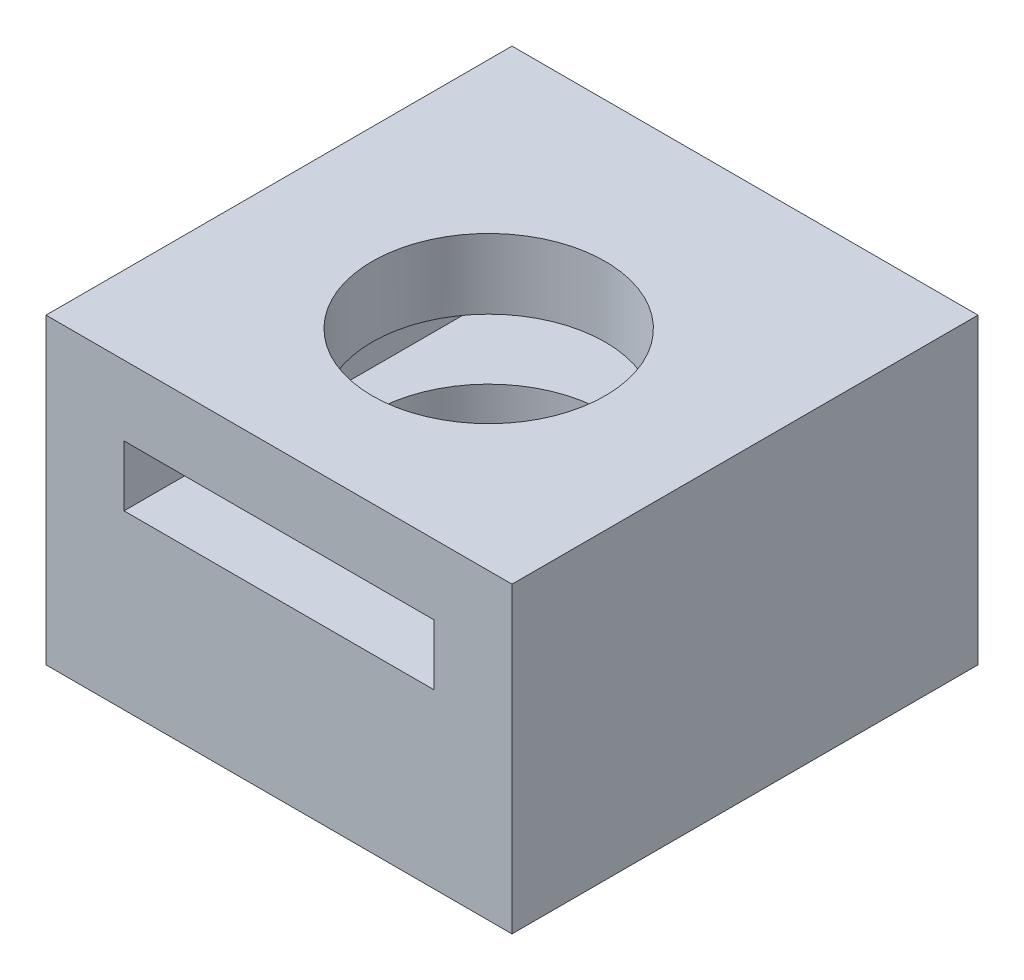
ISO-10303-21;
HEADER;
FILE_DESCRIPTION(('STEP AP214'),'2;1');
FILE_NAME('part.step','',(''),(''),'','','');
FILE_SCHEMA(('AUTOMOTIVE_DESIGN { 1 0 10303 214 1 1 1 1 }'));
ENDSEC;
DATA;
#1=APPLICATION_CONTEXT('core data for automotive mechanical design processes');
#2=APPLICATION_PROTOCOL_DEFINITION('international standard','automotive_design',2000,#1);
#3=PRODUCT_CONTEXT('',#1,'mechanical');
#4=PRODUCT('Part','Part','',(#3));
#5=PRODUCT_RELATED_PRODUCT_CATEGORY('part','',(#4));
#6=PRODUCT_DEFINITION_FORMATION('','',#4);
#7=PRODUCT_DEFINITION_CONTEXT('part definition',#1,'design');
#8=PRODUCT_DEFINITION('design','',#6,#7);
#9=PRODUCT_DEFINITION_SHAPE('','',#8);
#10=(LENGTH_UNIT() NAMED_UNIT(*) SI_UNIT(.MILLI.,.METRE.));
#11=(NAMED_UNIT(*) PLANE_ANGLE_UNIT() SI_UNIT($,.RADIAN.));
#12=(NAMED_UNIT(*) SI_UNIT($,.STERADIAN.) SOLID_ANGLE_UNIT());
#13=UNCERTAINTY_MEASURE_WITH_UNIT(LENGTH_MEASURE(1.E-05),#10,'distance_accuracy_value','');
#14=(GEOMETRIC_REPRESENTATION_CONTEXT(3) GLOBAL_UNCERTAINTY_ASSIGNED_CONTEXT((#13)) GLOBAL_UNIT_ASSIGNED_CONTEXT((#10,
#11,#12)) REPRESENTATION_CONTEXT('',''));
#15=CARTESIAN_POINT('',(0.,0.,0.));
#16=DIRECTION('',(0.,0.,1.));
#17=DIRECTION('',(1.,0.,0.));
#18=AXIS2_PLACEMENT_3D('',#15,#16,#17);
#19=CARTESIAN_POINT('',(0.,13.,0.));
#20=DIRECTION('',(-1.,0.,0.));
#21=DIRECTION('',(0.,0.,1.));
#22=AXIS2_PLACEMENT_3D('',#19,#20,#21);
#23=PLANE('',#22);
#24=DIRECTION('',(0.,0.,-1.));
#25=VECTOR('',#24,1.);
#26=CARTESIAN_POINT('',(0.,0.,0.));
#27=LINE('',#26,#25);
#28=CARTESIAN_POINT('',(0.,0.,20.));
#29=VERTEX_POINT('',#28);
#30=CARTESIAN_POINT('',(0.,0.,0.));
#31=VERTEX_POINT('',#30);
#32=EDGE_CURVE('E162',#29,#31,#27,.T.);
#33=ORIENTED_EDGE('',*,*,#32,.T.);
#34=DIRECTION('',(0.,-1.,0.));
#35=VECTOR('',#34,1.);
#36=CARTESIAN_POINT('',(0.,13.,0.));
#37=LINE('',#36,#35);
#38=CARTESIAN_POINT('',(0.,13.,0.));
#39=VERTEX_POINT('',#38);
#40=EDGE_CURVE('E11',#39,#31,#37,.T.);
#41=ORIENTED_EDGE('',*,*,#40,.F.);
#42=DIRECTION('',(0.,0.,-1.));
#43=VECTOR('',#42,1.);
#44=CARTESIAN_POINT('',(0.,13.,0.));
#45=LINE('',#44,#43);
#46=CARTESIAN_POINT('',(0.,13.,20.));
#47=VERTEX_POINT('',#46);
#48=EDGE_CURVE('E168',#47,#39,#45,.T.);
#49=ORIENTED_EDGE('',*,*,#48,.F.);
#50=DIRECTION('',(0.,-1.,0.));
#51=VECTOR('',#50,1.);
#52=CARTESIAN_POINT('',(0.,13.,20.));
#53=LINE('',#52,#51);
#54=EDGE_CURVE('E178',#47,#29,#53,.T.);
#55=ORIENTED_EDGE('',*,*,#54,.T.);
#56=EDGE_LOOP('',(#33,#41,#49,#55));
#57=FACE_BOUND('',#56,.T.);
#58=ADVANCED_FACE('F39',(#57),#23,.F.);
#59=CARTESIAN_POINT('',(0.,13.,0.));
#60=DIRECTION('',(0.,0.,1.));
#61=DIRECTION('',(1.,0.,0.));
#62=AXIS2_PLACEMENT_3D('',#59,#60,#61);
#63=PLANE('',#62);
#64=DIRECTION('',(-1.,0.,0.));
#65=VECTOR('',#64,1.);
#66=CARTESIAN_POINT('',(0.,0.,0.));
#67=LINE('',#66,#65);
#68=CARTESIAN_POINT('',(-20.,0.,0.));
#69=VERTEX_POINT('',#68);
#70=EDGE_CURVE('E182',#31,#69,#67,.T.);
#71=ORIENTED_EDGE('',*,*,#70,.T.);
#72=DIRECTION('',(0.,-1.,0.));
#73=VECTOR('',#72,1.);
#74=CARTESIAN_POINT('',(-20.,13.,0.));
#75=LINE('',#74,#73);
#76=CARTESIAN_POINT('',(-20.,13.,0.));
#77=VERTEX_POINT('',#76);
#78=EDGE_CURVE('E48',#77,#69,#75,.T.);
#79=ORIENTED_EDGE('',*,*,#78,.F.);
#80=DIRECTION('',(-1.,0.,0.));
#81=VECTOR('',#80,1.);
#82=CARTESIAN_POINT('',(0.,13.,0.));
#83=LINE('',#82,#81);
#84=EDGE_CURVE('E92',#39,#77,#83,.T.);
#85=ORIENTED_EDGE('',*,*,#84,.F.);
#86=ORIENTED_EDGE('',*,*,#40,.T.);
#87=EDGE_LOOP('',(#71,#79,#85,#86));
#88=FACE_BOUND('',#87,.T.);
#89=ADVANCED_FACE('F219',(#88),#63,.F.);
#90=CARTESIAN_POINT('',(-20.,13.,0.));
#91=DIRECTION('',(1.,0.,0.));
#92=DIRECTION('',(0.,0.,-1.));
#93=AXIS2_PLACEMENT_3D('',#90,#91,#92);
#94=PLANE('',#93);
#95=DIRECTION('',(0.,0.,1.));
#96=VECTOR('',#95,1.);
#97=CARTESIAN_POINT('',(-20.,0.,0.));
#98=LINE('',#97,#96);
#99=CARTESIAN_POINT('',(-20.,0.,20.));
#100=VERTEX_POINT('',#99);
#101=EDGE_CURVE('E185',#69,#100,#98,.T.);
#102=ORIENTED_EDGE('',*,*,#101,.T.);
#103=DIRECTION('',(0.,-1.,0.));
#104=VECTOR('',#103,1.);
#105=CARTESIAN_POINT('',(-20.,13.,20.));
#106=LINE('',#105,#104);
#107=CARTESIAN_POINT('',(-20.,13.,20.));
#108=VERTEX_POINT('',#107);
#109=EDGE_CURVE('E192',#108,#100,#106,.T.);
#110=ORIENTED_EDGE('',*,*,#109,.F.);
#111=DIRECTION('',(0.,0.,1.));
#112=VECTOR('',#111,1.);
#113=CARTESIAN_POINT('',(-20.,13.,0.));
#114=LINE('',#113,#112);
#115=EDGE_CURVE('E173',#77,#108,#114,.T.);
#116=ORIENTED_EDGE('',*,*,#115,.F.);
#117=ORIENTED_EDGE('',*,*,#78,.T.);
#118=EDGE_LOOP('',(#102,#110,#116,#117));
#119=FACE_BOUND('',#118,.T.);
#120=ADVANCED_FACE('F200',(#119),#94,.F.);
#121=CARTESIAN_POINT('',(0.,13.,20.));
#122=DIRECTION('',(0.,0.,-1.));
#123=DIRECTION('',(-1.,0.,0.));
#124=AXIS2_PLACEMENT_3D('',#121,#122,#123);
#125=PLANE('',#124);
#126=DIRECTION('',(1.,0.,0.));
#127=VECTOR('',#126,1.);
#128=CARTESIAN_POINT('',(-16.65,7.4,20.));
#129=LINE('',#128,#127);
#130=CARTESIAN_POINT('',(-16.65,7.4,20.));
#131=VERTEX_POINT('',#130);
#132=CARTESIAN_POINT('',(-3.34999999999999,7.4,20.));
#133=VERTEX_POINT('',#132);
#134=EDGE_CURVE('E153',#131,#133,#129,.T.);
#135=ORIENTED_EDGE('',*,*,#134,.F.);
#136=DIRECTION('',(0.,-1.,0.));
#137=VECTOR('',#136,1.);
#138=CARTESIAN_POINT('',(-16.65,10.,20.));
#139=LINE('',#138,#137);
#140=CARTESIAN_POINT('',(-16.65,10.,20.));
#141=VERTEX_POINT('',#140);
#142=EDGE_CURVE('E55',#141,#131,#139,.T.);
#143=ORIENTED_EDGE('',*,*,#142,.F.);
#144=DIRECTION('',(-1.,0.,0.));
#145=VECTOR('',#144,1.);
#146=CARTESIAN_POINT('',(-16.65,10.,20.));
#147=LINE('',#146,#145);
#148=CARTESIAN_POINT('',(-3.34999999999999,10.,20.));
#149=VERTEX_POINT('',#148);
#150=EDGE_CURVE('E137',#149,#141,#147,.T.);
#151=ORIENTED_EDGE('',*,*,#150,.F.);
#152=DIRECTION('',(0.,1.,0.));
#153=VECTOR('',#152,1.);
#154=CARTESIAN_POINT('',(-3.34999999999999,10.,20.));
#155=LINE('',#154,#153);
#156=EDGE_CURVE('E141',#133,#149,#155,.T.);
#157=ORIENTED_EDGE('',*,*,#156,.F.);
#158=EDGE_LOOP('',(#135,#143,#151,#157));
#159=FACE_BOUND('',#158,.T.);
#160=DIRECTION('',(1.,0.,0.));
#161=VECTOR('',#160,1.);
#162=CARTESIAN_POINT('',(0.,0.,20.));
#163=LINE('',#162,#161);
#164=EDGE_CURVE('E85',#100,#29,#163,.T.);
#165=ORIENTED_EDGE('',*,*,#164,.T.);
#166=ORIENTED_EDGE('',*,*,#54,.F.);
#167=DIRECTION('',(1.,0.,0.));
#168=VECTOR('',#167,1.);
#169=CARTESIAN_POINT('',(0.,13.,20.));
#170=LINE('',#169,#168);
#171=EDGE_CURVE('E64',#108,#47,#170,.T.);
#172=ORIENTED_EDGE('',*,*,#171,.F.);
#173=ORIENTED_EDGE('',*,*,#109,.T.);
#174=EDGE_LOOP('',(#165,#166,#172,#173));
#175=FACE_BOUND('',#174,.T.);
#176=ADVANCED_FACE('F208',(#159,#175),#125,.F.);
#177=CARTESIAN_POINT('',(0.,13.,0.));
#178=DIRECTION('',(0.,-1.,0.));
#179=DIRECTION('',(0.,0.,-1.));
#180=AXIS2_PLACEMENT_3D('',#177,#178,#179);
#181=PLANE('',#180);
#182=CARTESIAN_POINT('',(-10.,13.,11.));
#183=DIRECTION('',(0.,1.,0.));
#184=DIRECTION('',(0.,0.,1.));
#185=AXIS2_PLACEMENT_3D('',#182,#183,#184);
#186=CIRCLE('',#185,5.);
#187=CARTESIAN_POINT('',(-10.,13.,16.));
#188=VERTEX_POINT('',#187);
#189=EDGE_CURVE('E321',#188,#188,#186,.T.);
#190=ORIENTED_EDGE('',*,*,#189,.F.);
#191=EDGE_LOOP('',(#190));
#192=FACE_BOUND('',#191,.T.);
#193=ORIENTED_EDGE('',*,*,#48,.T.);
#194=ORIENTED_EDGE('',*,*,#84,.T.);
#195=ORIENTED_EDGE('',*,*,#115,.T.);
#196=ORIENTED_EDGE('',*,*,#171,.T.);
#197=EDGE_LOOP('',(#193,#194,#195,#196));
#198=FACE_BOUND('',#197,.T.);
#199=ADVANCED_FACE('F210',(#192,#198),#181,.F.);
#200=CARTESIAN_POINT('',(0.,0.,0.));
#201=DIRECTION('',(0.,-1.,0.));
#202=DIRECTION('',(0.,0.,-1.));
#203=AXIS2_PLACEMENT_3D('',#200,#201,#202);
#204=PLANE('',#203);
#205=CARTESIAN_POINT('',(-10.,0.,11.));
#206=DIRECTION('',(0.,-1.,0.));
#207=DIRECTION('',(0.,0.,-1.));
#208=AXIS2_PLACEMENT_3D('',#205,#206,#207);
#209=CIRCLE('',#208,5.);
#210=CARTESIAN_POINT('',(-10.,0.,6.));
#211=VERTEX_POINT('',#210);
#212=EDGE_CURVE('E327',#211,#211,#209,.F.);
#213=ORIENTED_EDGE('',*,*,#212,.T.);
#214=EDGE_LOOP('',(#213));
#215=FACE_BOUND('',#214,.T.);
#216=ORIENTED_EDGE('',*,*,#32,.F.);
#217=ORIENTED_EDGE('',*,*,#164,.F.);
#218=ORIENTED_EDGE('',*,*,#101,.F.);
#219=ORIENTED_EDGE('',*,*,#70,.F.);
#220=EDGE_LOOP('',(#216,#217,#218,#219));
#221=FACE_BOUND('',#220,.T.);
#222=ADVANCED_FACE('F204',(#215,#221),#204,.T.);
#223=CARTESIAN_POINT('',(-16.65,10.,2.));
#224=DIRECTION('',(-1.,0.,0.));
#225=DIRECTION('',(0.,0.,1.));
#226=AXIS2_PLACEMENT_3D('',#223,#224,#225);
#227=PLANE('',#226);
#228=ORIENTED_EDGE('',*,*,#142,.T.);
#229=DIRECTION('',(0.,0.,1.));
#230=VECTOR('',#229,1.);
#231=CARTESIAN_POINT('',(-16.65,7.4,2.));
#232=LINE('',#231,#230);
#233=CARTESIAN_POINT('',(-16.65,7.4,2.));
#234=VERTEX_POINT('',#233);
#235=EDGE_CURVE('E112',#234,#131,#232,.T.);
#236=ORIENTED_EDGE('',*,*,#235,.F.);
#237=DIRECTION('',(0.,-1.,0.));
#238=VECTOR('',#237,1.);
#239=CARTESIAN_POINT('',(-16.65,10.,2.));
#240=LINE('',#239,#238);
#241=CARTESIAN_POINT('',(-16.65,10.,2.));
#242=VERTEX_POINT('',#241);
#243=EDGE_CURVE('E116',#242,#234,#240,.T.);
#244=ORIENTED_EDGE('',*,*,#243,.F.);
#245=DIRECTION('',(0.,0.,1.));
#246=VECTOR('',#245,1.);
#247=CARTESIAN_POINT('',(-16.65,10.,2.));
#248=LINE('',#247,#246);
#249=EDGE_CURVE('E159',#242,#141,#248,.T.);
#250=ORIENTED_EDGE('',*,*,#249,.T.);
#251=EDGE_LOOP('',(#228,#236,#244,#250));
#252=FACE_BOUND('',#251,.T.);
#253=ADVANCED_FACE('F114',(#252),#227,.F.);
#254=CARTESIAN_POINT('',(-16.65,10.,2.));
#255=DIRECTION('',(0.,1.,0.));
#256=DIRECTION('',(-1.,0.,0.));
#257=AXIS2_PLACEMENT_3D('',#254,#255,#256);
#258=PLANE('',#257);
#259=CARTESIAN_POINT('',(-10.,10.,11.));
#260=DIRECTION('',(0.,1.,0.));
#261=DIRECTION('',(-1.,0.,0.));
#262=AXIS2_PLACEMENT_3D('',#259,#260,#261);
#263=CIRCLE('',#262,5.);
#264=CARTESIAN_POINT('',(-15.,10.,11.));
#265=VERTEX_POINT('',#264);
#266=EDGE_CURVE('E144',#265,#265,#263,.T.);
#267=ORIENTED_EDGE('',*,*,#266,.T.);
#268=EDGE_LOOP('',(#267));
#269=FACE_BOUND('',#268,.T.);
#270=ORIENTED_EDGE('',*,*,#150,.T.);
#271=ORIENTED_EDGE('',*,*,#249,.F.);
#272=DIRECTION('',(-1.,0.,0.));
#273=VECTOR('',#272,1.);
#274=CARTESIAN_POINT('',(-16.65,10.,2.));
#275=LINE('',#274,#273);
#276=CARTESIAN_POINT('',(-3.34999999999999,10.,2.));
#277=VERTEX_POINT('',#276);
#278=EDGE_CURVE('E123',#277,#242,#275,.T.);
#279=ORIENTED_EDGE('',*,*,#278,.F.);
#280=DIRECTION('',(0.,0.,1.));
#281=VECTOR('',#280,1.);
#282=CARTESIAN_POINT('',(-3.34999999999999,10.,2.));
#283=LINE('',#282,#281);
#284=EDGE_CURVE('E163',#277,#149,#283,.T.);
#285=ORIENTED_EDGE('',*,*,#284,.T.);
#286=EDGE_LOOP('',(#270,#271,#279,#285));
#287=FACE_BOUND('',#286,.T.);
#288=ADVANCED_FACE('F246',(#269,#287),#258,.F.);
#289=CARTESIAN_POINT('',(-3.34999999999999,10.,2.));
#290=DIRECTION('',(1.,0.,0.));
#291=DIRECTION('',(0.,0.,-1.));
#292=AXIS2_PLACEMENT_3D('',#289,#290,#291);
#293=PLANE('',#292);
#294=ORIENTED_EDGE('',*,*,#156,.T.);
#295=ORIENTED_EDGE('',*,*,#284,.F.);
#296=DIRECTION('',(0.,1.,0.));
#297=VECTOR('',#296,1.);
#298=CARTESIAN_POINT('',(-3.34999999999999,10.,2.));
#299=LINE('',#298,#297);
#300=CARTESIAN_POINT('',(-3.34999999999999,7.4,2.));
#301=VERTEX_POINT('',#300);
#302=EDGE_CURVE('E132',#301,#277,#299,.T.);
#303=ORIENTED_EDGE('',*,*,#302,.F.);
#304=DIRECTION('',(0.,0.,1.));
#305=VECTOR('',#304,1.);
#306=CARTESIAN_POINT('',(-3.34999999999999,7.4,2.));
#307=LINE('',#306,#305);
#308=EDGE_CURVE('E122',#301,#133,#307,.T.);
#309=ORIENTED_EDGE('',*,*,#308,.T.);
#310=EDGE_LOOP('',(#294,#295,#303,#309));
#311=FACE_BOUND('',#310,.T.);
#312=ADVANCED_FACE('F255',(#311),#293,.F.);
#313=CARTESIAN_POINT('',(-16.65,7.4,2.));
#314=DIRECTION('',(0.,-1.,0.));
#315=DIRECTION('',(0.,0.,-1.));
#316=AXIS2_PLACEMENT_3D('',#313,#314,#315);
#317=PLANE('',#316);
#318=CARTESIAN_POINT('',(-10.,7.4,11.));
#319=DIRECTION('',(0.,-1.,0.));
#320=DIRECTION('',(0.,0.,-1.));
#321=AXIS2_PLACEMENT_3D('',#318,#319,#320);
#322=CIRCLE('',#321,5.);
#323=CARTESIAN_POINT('',(-10.,7.4,6.));
#324=VERTEX_POINT('',#323);
#325=EDGE_CURVE('E42',#324,#324,#322,.T.);
#326=ORIENTED_EDGE('',*,*,#325,.T.);
#327=EDGE_LOOP('',(#326));
#328=FACE_BOUND('',#327,.T.);
#329=ORIENTED_EDGE('',*,*,#134,.T.);
#330=ORIENTED_EDGE('',*,*,#308,.F.);
#331=DIRECTION('',(1.,0.,0.));
#332=VECTOR('',#331,1.);
#333=CARTESIAN_POINT('',(-16.65,7.4,2.));
#334=LINE('',#333,#332);
#335=EDGE_CURVE('E126',#234,#301,#334,.T.);
#336=ORIENTED_EDGE('',*,*,#335,.F.);
#337=ORIENTED_EDGE('',*,*,#235,.T.);
#338=EDGE_LOOP('',(#329,#330,#336,#337));
#339=FACE_BOUND('',#338,.T.);
#340=ADVANCED_FACE('F127',(#328,#339),#317,.F.);
#341=CARTESIAN_POINT('',(0.,0.,2.));
#342=DIRECTION('',(0.,0.,1.));
#343=DIRECTION('',(1.,0.,0.));
#344=AXIS2_PLACEMENT_3D('',#341,#342,#343);
#345=PLANE('',#344);
#346=ORIENTED_EDGE('',*,*,#243,.T.);
#347=ORIENTED_EDGE('',*,*,#335,.T.);
#348=ORIENTED_EDGE('',*,*,#302,.T.);
#349=ORIENTED_EDGE('',*,*,#278,.T.);
#350=EDGE_LOOP('',(#346,#347,#348,#349));
#351=FACE_BOUND('',#350,.T.);
#352=ADVANCED_FACE('F134',(#351),#345,.T.);
#353=CARTESIAN_POINT('',(-10.,-14.142135623731,11.));
#354=DIRECTION('',(0.,1.,0.));
#355=DIRECTION('',(0.,0.,1.));
#356=AXIS2_PLACEMENT_3D('',#353,#354,#355);
#357=CYLINDRICAL_SURFACE('',#356,5.);
#358=ORIENTED_EDGE('',*,*,#212,.F.);
#359=EDGE_LOOP('',(#358));
#360=FACE_BOUND('',#359,.T.);
#361=ORIENTED_EDGE('',*,*,#325,.F.);
#362=EDGE_LOOP('',(#361));
#363=FACE_BOUND('',#362,.T.);
#364=ADVANCED_FACE('F271',(#360,#363),#357,.F.);
#365=ORIENTED_EDGE('',*,*,#189,.T.);
#366=EDGE_LOOP('',(#365));
#367=FACE_BOUND('',#366,.T.);
#368=ORIENTED_EDGE('',*,*,#266,.F.);
#369=EDGE_LOOP('',(#368));
#370=FACE_BOUND('',#369,.T.);
#371=ADVANCED_FACE('F305',(#367,#370),#357,.F.);
#372=CLOSED_SHELL('',(#58,#89,#120,#176,#199,#222,#253,#288,#312,#340,#352,#364,#371));
#373=MANIFOLD_SOLID_BREP('B2',#372);
#374=ADVANCED_BREP_SHAPE_REPRESENTATION('',(#18,#373),#14);
#375=SHAPE_DEFINITION_REPRESENTATION(#9,#374);
ENDSEC;
END-ISO-10303-21;
